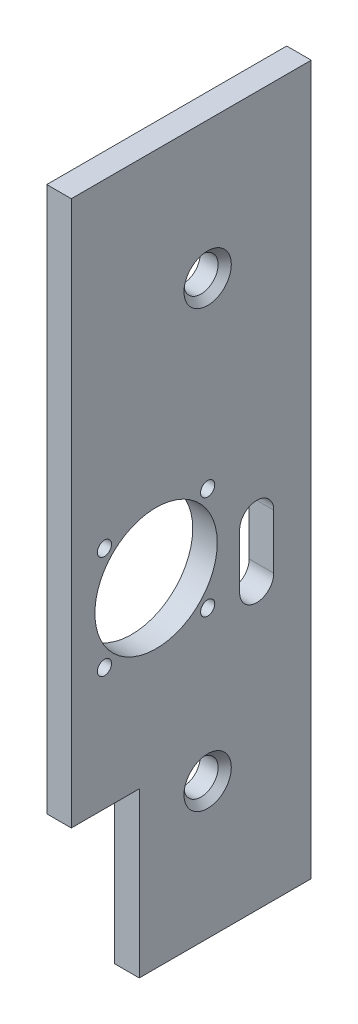
ISO-10303-21;
HEADER;
FILE_DESCRIPTION(('STEP AP214'),'2;1');
FILE_NAME('part.step','',(''),(''),'','','');
FILE_SCHEMA(('AUTOMOTIVE_DESIGN { 1 0 10303 214 1 1 1 1 }'));
ENDSEC;
DATA;
#1=APPLICATION_CONTEXT('core data for automotive mechanical design processes');
#2=APPLICATION_PROTOCOL_DEFINITION('international standard','automotive_design',2000,#1);
#3=PRODUCT_CONTEXT('',#1,'mechanical');
#4=PRODUCT('Part','Part','',(#3));
#5=PRODUCT_RELATED_PRODUCT_CATEGORY('part','',(#4));
#6=PRODUCT_DEFINITION_FORMATION('','',#4);
#7=PRODUCT_DEFINITION_CONTEXT('part definition',#1,'design');
#8=PRODUCT_DEFINITION('design','',#6,#7);
#9=PRODUCT_DEFINITION_SHAPE('','',#8);
#10=(LENGTH_UNIT() NAMED_UNIT(*) SI_UNIT(.MILLI.,.METRE.));
#11=(NAMED_UNIT(*) PLANE_ANGLE_UNIT() SI_UNIT($,.RADIAN.));
#12=(NAMED_UNIT(*) SI_UNIT($,.STERADIAN.) SOLID_ANGLE_UNIT());
#13=UNCERTAINTY_MEASURE_WITH_UNIT(LENGTH_MEASURE(1.E-05),#10,'distance_accuracy_value','');
#14=(GEOMETRIC_REPRESENTATION_CONTEXT(3) GLOBAL_UNCERTAINTY_ASSIGNED_CONTEXT((#13)) GLOBAL_UNIT_ASSIGNED_CONTEXT((#10,
#11,#12)) REPRESENTATION_CONTEXT('',''));
#15=CARTESIAN_POINT('',(0.,0.,0.));
#16=DIRECTION('',(0.,0.,1.));
#17=DIRECTION('',(1.,0.,0.));
#18=AXIS2_PLACEMENT_3D('',#15,#16,#17);
#19=CARTESIAN_POINT('',(5.715,0.,55.88));
#20=DIRECTION('',(0.,0.,-1.));
#21=DIRECTION('',(0.,1.,0.));
#22=AXIS2_PLACEMENT_3D('',#19,#20,#21);
#23=PLANE('',#22);
#24=DIRECTION('',(0.,-1.,0.));
#25=VECTOR('',#24,1.);
#26=CARTESIAN_POINT('',(0.,0.,55.88));
#27=LINE('',#26,#25);
#28=CARTESIAN_POINT('',(0.,0.,55.88));
#29=VERTEX_POINT('',#28);
#30=CARTESIAN_POINT('',(0.,-126.937814396124,55.88));
#31=VERTEX_POINT('',#30);
#32=EDGE_CURVE('E197',#29,#31,#27,.T.);
#33=ORIENTED_EDGE('',*,*,#32,.T.);
#34=DIRECTION('',(-1.,0.,0.));
#35=VECTOR('',#34,1.);
#36=CARTESIAN_POINT('',(5.715,-126.937814396124,55.88));
#37=LINE('',#36,#35);
#38=CARTESIAN_POINT('',(5.715,-126.937814396124,55.88));
#39=VERTEX_POINT('',#38);
#40=EDGE_CURVE('E227',#39,#31,#37,.T.);
#41=ORIENTED_EDGE('',*,*,#40,.F.);
#42=DIRECTION('',(0.,-1.,0.));
#43=VECTOR('',#42,1.);
#44=CARTESIAN_POINT('',(5.715,0.,55.88));
#45=LINE('',#44,#43);
#46=CARTESIAN_POINT('',(5.715,0.,55.88));
#47=VERTEX_POINT('',#46);
#48=EDGE_CURVE('E280',#47,#39,#45,.T.);
#49=ORIENTED_EDGE('',*,*,#48,.F.);
#50=DIRECTION('',(-1.,0.,0.));
#51=VECTOR('',#50,1.);
#52=CARTESIAN_POINT('',(5.715,0.,55.88));
#53=LINE('',#52,#51);
#54=EDGE_CURVE('E217',#47,#29,#53,.T.);
#55=ORIENTED_EDGE('',*,*,#54,.T.);
#56=EDGE_LOOP('',(#33,#41,#49,#55));
#57=FACE_BOUND('',#56,.T.);
#58=ADVANCED_FACE('F53',(#57),#23,.F.);
#59=CARTESIAN_POINT('',(5.715,-126.937814396124,0.));
#60=DIRECTION('',(0.,1.,0.));
#61=DIRECTION('',(0.,0.,1.));
#62=AXIS2_PLACEMENT_3D('',#59,#60,#61);
#63=PLANE('',#62);
#64=DIRECTION('',(0.,0.,-1.));
#65=VECTOR('',#64,1.);
#66=CARTESIAN_POINT('',(0.,-126.937814396124,0.));
#67=LINE('',#66,#65);
#68=CARTESIAN_POINT('',(0.,-126.937814396124,40.0525783544723));
#69=VERTEX_POINT('',#68);
#70=EDGE_CURVE('E201',#31,#69,#67,.T.);
#71=ORIENTED_EDGE('',*,*,#70,.T.);
#72=DIRECTION('',(-1.,0.,0.));
#73=VECTOR('',#72,1.);
#74=CARTESIAN_POINT('',(5.715,-126.937814396124,40.0525783544723));
#75=LINE('',#74,#73);
#76=CARTESIAN_POINT('',(5.715,-126.937814396124,40.0525783544723));
#77=VERTEX_POINT('',#76);
#78=EDGE_CURVE('E224',#77,#69,#75,.T.);
#79=ORIENTED_EDGE('',*,*,#78,.F.);
#80=DIRECTION('',(0.,0.,-1.));
#81=VECTOR('',#80,1.);
#82=CARTESIAN_POINT('',(5.715,-126.937814396124,0.));
#83=LINE('',#82,#81);
#84=EDGE_CURVE('E354',#39,#77,#83,.T.);
#85=ORIENTED_EDGE('',*,*,#84,.F.);
#86=ORIENTED_EDGE('',*,*,#40,.T.);
#87=EDGE_LOOP('',(#71,#79,#85,#86));
#88=FACE_BOUND('',#87,.T.);
#89=ADVANCED_FACE('F294',(#88),#63,.F.);
#90=CARTESIAN_POINT('',(5.715,0.,40.0525783544723));
#91=DIRECTION('',(0.,0.,1.));
#92=DIRECTION('',(1.,0.,0.));
#93=AXIS2_PLACEMENT_3D('',#90,#91,#92);
#94=PLANE('',#93);
#95=DIRECTION('',(0.,1.,0.));
#96=VECTOR('',#95,1.);
#97=CARTESIAN_POINT('',(0.,0.,40.0525783544723));
#98=LINE('',#97,#96);
#99=CARTESIAN_POINT('',(0.,-165.1,40.0525783544723));
#100=VERTEX_POINT('',#99);
#101=EDGE_CURVE('E205',#100,#69,#98,.T.);
#102=ORIENTED_EDGE('',*,*,#101,.F.);
#103=DIRECTION('',(-1.,0.,0.));
#104=VECTOR('',#103,1.);
#105=CARTESIAN_POINT('',(5.715,-165.1,40.0525783544723));
#106=LINE('',#105,#104);
#107=CARTESIAN_POINT('',(5.715,-165.1,40.0525783544723));
#108=VERTEX_POINT('',#107);
#109=EDGE_CURVE('E151',#108,#100,#106,.T.);
#110=ORIENTED_EDGE('',*,*,#109,.F.);
#111=DIRECTION('',(0.,1.,0.));
#112=VECTOR('',#111,1.);
#113=CARTESIAN_POINT('',(5.715,0.,40.0525783544723));
#114=LINE('',#113,#112);
#115=EDGE_CURVE('E157',#108,#77,#114,.T.);
#116=ORIENTED_EDGE('',*,*,#115,.T.);
#117=ORIENTED_EDGE('',*,*,#78,.T.);
#118=EDGE_LOOP('',(#102,#110,#116,#117));
#119=FACE_BOUND('',#118,.T.);
#120=ADVANCED_FACE('F299',(#119),#94,.T.);
#121=CARTESIAN_POINT('',(5.715,-165.1,0.));
#122=DIRECTION('',(0.,-1.,0.));
#123=DIRECTION('',(0.,0.,-1.));
#124=AXIS2_PLACEMENT_3D('',#121,#122,#123);
#125=PLANE('',#124);
#126=DIRECTION('',(0.,0.,1.));
#127=VECTOR('',#126,1.);
#128=CARTESIAN_POINT('',(0.,-165.1,0.));
#129=LINE('',#128,#127);
#130=CARTESIAN_POINT('',(0.,-165.1,0.));
#131=VERTEX_POINT('',#130);
#132=EDGE_CURVE('E145',#131,#100,#129,.T.);
#133=ORIENTED_EDGE('',*,*,#132,.F.);
#134=DIRECTION('',(-1.,0.,0.));
#135=VECTOR('',#134,1.);
#136=CARTESIAN_POINT('',(5.715,-165.1,0.));
#137=LINE('',#136,#135);
#138=CARTESIAN_POINT('',(5.715,-165.1,0.));
#139=VERTEX_POINT('',#138);
#140=EDGE_CURVE('E140',#139,#131,#137,.T.);
#141=ORIENTED_EDGE('',*,*,#140,.F.);
#142=DIRECTION('',(0.,0.,1.));
#143=VECTOR('',#142,1.);
#144=CARTESIAN_POINT('',(5.715,-165.1,0.));
#145=LINE('',#144,#143);
#146=EDGE_CURVE('E143',#139,#108,#145,.T.);
#147=ORIENTED_EDGE('',*,*,#146,.T.);
#148=ORIENTED_EDGE('',*,*,#109,.T.);
#149=EDGE_LOOP('',(#133,#141,#147,#148));
#150=FACE_BOUND('',#149,.T.);
#151=ADVANCED_FACE('F142',(#150),#125,.T.);
#152=CARTESIAN_POINT('',(5.715,0.,0.));
#153=DIRECTION('',(0.,0.,-1.));
#154=DIRECTION('',(0.,1.,0.));
#155=AXIS2_PLACEMENT_3D('',#152,#153,#154);
#156=PLANE('',#155);
#157=DIRECTION('',(0.,-1.,0.));
#158=VECTOR('',#157,1.);
#159=CARTESIAN_POINT('',(0.,0.,0.));
#160=LINE('',#159,#158);
#161=CARTESIAN_POINT('',(0.,0.,0.));
#162=VERTEX_POINT('',#161);
#163=EDGE_CURVE('E211',#162,#131,#160,.T.);
#164=ORIENTED_EDGE('',*,*,#163,.F.);
#165=DIRECTION('',(-1.,0.,0.));
#166=VECTOR('',#165,1.);
#167=CARTESIAN_POINT('',(5.715,0.,0.));
#168=LINE('',#167,#166);
#169=CARTESIAN_POINT('',(5.715,0.,0.));
#170=VERTEX_POINT('',#169);
#171=EDGE_CURVE('E106',#170,#162,#168,.T.);
#172=ORIENTED_EDGE('',*,*,#171,.F.);
#173=DIRECTION('',(0.,-1.,0.));
#174=VECTOR('',#173,1.);
#175=CARTESIAN_POINT('',(5.715,0.,0.));
#176=LINE('',#175,#174);
#177=EDGE_CURVE('E155',#170,#139,#176,.T.);
#178=ORIENTED_EDGE('',*,*,#177,.T.);
#179=ORIENTED_EDGE('',*,*,#140,.T.);
#180=EDGE_LOOP('',(#164,#172,#178,#179));
#181=FACE_BOUND('',#180,.T.);
#182=ADVANCED_FACE('F160',(#181),#156,.T.);
#183=CARTESIAN_POINT('',(5.715,-86.3988461493055,12.7));
#184=DIRECTION('',(-1.,0.,0.));
#185=DIRECTION('',(0.,0.,1.));
#186=AXIS2_PLACEMENT_3D('',#183,#184,#185);
#187=CYLINDRICAL_SURFACE('',#186,3.96875);
#188=CARTESIAN_POINT('',(0.,-86.3988461493055,12.7));
#189=DIRECTION('',(1.,0.,0.));
#190=DIRECTION('',(0.,0.,-1.));
#191=AXIS2_PLACEMENT_3D('',#188,#189,#190);
#192=CIRCLE('',#191,3.96875);
#193=CARTESIAN_POINT('',(0.,-86.3988461493055,8.73124999999999));
#194=VERTEX_POINT('',#193);
#195=CARTESIAN_POINT('',(0.,-86.3988461493055,16.66875));
#196=VERTEX_POINT('',#195);
#197=EDGE_CURVE('E172',#194,#196,#192,.T.);
#198=ORIENTED_EDGE('',*,*,#197,.F.);
#199=DIRECTION('',(-1.,0.,0.));
#200=VECTOR('',#199,1.);
#201=CARTESIAN_POINT('',(5.715,-86.3988461493055,8.73124999999999));
#202=LINE('',#201,#200);
#203=CARTESIAN_POINT('',(5.715,-86.3988461493055,8.73124999999999));
#204=VERTEX_POINT('',#203);
#205=EDGE_CURVE('E117',#204,#194,#202,.T.);
#206=ORIENTED_EDGE('',*,*,#205,.F.);
#207=CARTESIAN_POINT('',(5.715,-86.3988461493055,12.7));
#208=DIRECTION('',(1.,0.,0.));
#209=DIRECTION('',(0.,0.,-1.));
#210=AXIS2_PLACEMENT_3D('',#207,#208,#209);
#211=CIRCLE('',#210,3.96875);
#212=CARTESIAN_POINT('',(5.715,-86.3988461493055,16.66875));
#213=VERTEX_POINT('',#212);
#214=EDGE_CURVE('E341',#204,#213,#211,.T.);
#215=ORIENTED_EDGE('',*,*,#214,.T.);
#216=DIRECTION('',(-1.,0.,0.));
#217=VECTOR('',#216,1.);
#218=CARTESIAN_POINT('',(5.715,-86.3988461493055,16.66875));
#219=LINE('',#218,#217);
#220=EDGE_CURVE('E164',#213,#196,#219,.T.);
#221=ORIENTED_EDGE('',*,*,#220,.T.);
#222=EDGE_LOOP('',(#198,#206,#215,#221));
#223=FACE_BOUND('',#222,.T.);
#224=ADVANCED_FACE('F317',(#223),#187,.F.);
#225=CARTESIAN_POINT('',(5.715,0.,8.73124999999999));
#226=DIRECTION('',(0.,0.,1.));
#227=DIRECTION('',(1.,0.,0.));
#228=AXIS2_PLACEMENT_3D('',#225,#226,#227);
#229=PLANE('',#228);
#230=DIRECTION('',(0.,1.,0.));
#231=VECTOR('',#230,1.);
#232=CARTESIAN_POINT('',(0.,0.,8.73124999999999));
#233=LINE('',#232,#231);
#234=CARTESIAN_POINT('',(0.,-99.0988461493055,8.73124999999999));
#235=VERTEX_POINT('',#234);
#236=EDGE_CURVE('E177',#235,#194,#233,.T.);
#237=ORIENTED_EDGE('',*,*,#236,.F.);
#238=DIRECTION('',(-1.,0.,0.));
#239=VECTOR('',#238,1.);
#240=CARTESIAN_POINT('',(5.715,-99.0988461493055,8.73124999999999));
#241=LINE('',#240,#239);
#242=CARTESIAN_POINT('',(5.715,-99.0988461493055,8.73124999999999));
#243=VERTEX_POINT('',#242);
#244=EDGE_CURVE('E237',#243,#235,#241,.T.);
#245=ORIENTED_EDGE('',*,*,#244,.F.);
#246=DIRECTION('',(0.,1.,0.));
#247=VECTOR('',#246,1.);
#248=CARTESIAN_POINT('',(5.715,0.,8.73124999999999));
#249=LINE('',#248,#247);
#250=EDGE_CURVE('E335',#243,#204,#249,.T.);
#251=ORIENTED_EDGE('',*,*,#250,.T.);
#252=ORIENTED_EDGE('',*,*,#205,.T.);
#253=EDGE_LOOP('',(#237,#245,#251,#252));
#254=FACE_BOUND('',#253,.T.);
#255=ADVANCED_FACE('F313',(#254),#229,.T.);
#256=CARTESIAN_POINT('',(5.715,-99.0988461493055,12.7));
#257=DIRECTION('',(-1.,0.,0.));
#258=DIRECTION('',(0.,0.,1.));
#259=AXIS2_PLACEMENT_3D('',#256,#257,#258);
#260=CYLINDRICAL_SURFACE('',#259,3.96875);
#261=CARTESIAN_POINT('',(0.,-99.0988461493055,12.7));
#262=DIRECTION('',(1.,0.,0.));
#263=DIRECTION('',(0.,0.,-1.));
#264=AXIS2_PLACEMENT_3D('',#261,#262,#263);
#265=CIRCLE('',#264,3.96875);
#266=CARTESIAN_POINT('',(0.,-99.0988461493055,16.66875));
#267=VERTEX_POINT('',#266);
#268=EDGE_CURVE('E181',#267,#235,#265,.T.);
#269=ORIENTED_EDGE('',*,*,#268,.F.);
#270=DIRECTION('',(-1.,0.,0.));
#271=VECTOR('',#270,1.);
#272=CARTESIAN_POINT('',(5.715,-99.0988461493055,16.66875));
#273=LINE('',#272,#271);
#274=CARTESIAN_POINT('',(5.715,-99.0988461493055,16.66875));
#275=VERTEX_POINT('',#274);
#276=EDGE_CURVE('E234',#275,#267,#273,.T.);
#277=ORIENTED_EDGE('',*,*,#276,.F.);
#278=CARTESIAN_POINT('',(5.715,-99.0988461493055,12.7));
#279=DIRECTION('',(1.,0.,0.));
#280=DIRECTION('',(0.,0.,-1.));
#281=AXIS2_PLACEMENT_3D('',#278,#279,#280);
#282=CIRCLE('',#281,3.96875);
#283=EDGE_CURVE('E340',#275,#243,#282,.T.);
#284=ORIENTED_EDGE('',*,*,#283,.T.);
#285=ORIENTED_EDGE('',*,*,#244,.T.);
#286=EDGE_LOOP('',(#269,#277,#284,#285));
#287=FACE_BOUND('',#286,.T.);
#288=ADVANCED_FACE('F305',(#287),#260,.F.);
#289=CARTESIAN_POINT('',(5.715,-133.35,24.13));
#290=DIRECTION('',(-1.,0.,0.));
#291=DIRECTION('',(0.,0.,1.));
#292=AXIS2_PLACEMENT_3D('',#289,#290,#291);
#293=CYLINDRICAL_SURFACE('',#292,3.97510000000001);
#294=CARTESIAN_POINT('',(4.17829999999994,-133.35,24.13));
#295=DIRECTION('',(1.,0.,0.));
#296=DIRECTION('',(0.,0.,-1.));
#297=AXIS2_PLACEMENT_3D('',#294,#295,#296);
#298=CIRCLE('',#297,3.97510000000001);
#299=CARTESIAN_POINT('',(4.17829999999994,-133.35,20.1549));
#300=VERTEX_POINT('',#299);
#301=EDGE_CURVE('E11',#300,#300,#298,.T.);
#302=ORIENTED_EDGE('',*,*,#301,.T.);
#303=EDGE_LOOP('',(#302));
#304=FACE_BOUND('',#303,.T.);
#305=CARTESIAN_POINT('',(0.,-133.35,24.13));
#306=DIRECTION('',(1.,0.,0.));
#307=DIRECTION('',(0.,0.,-1.));
#308=AXIS2_PLACEMENT_3D('',#305,#306,#307);
#309=CIRCLE('',#308,3.97510000000001);
#310=CARTESIAN_POINT('',(0.,-133.35,20.1549));
#311=VERTEX_POINT('',#310);
#312=EDGE_CURVE('E193',#311,#311,#309,.T.);
#313=ORIENTED_EDGE('',*,*,#312,.F.);
#314=EDGE_LOOP('',(#313));
#315=FACE_BOUND('',#314,.T.);
#316=ADVANCED_FACE('F264',(#304,#315),#293,.F.);
#317=CARTESIAN_POINT('',(5.715,-31.9024,24.13));
#318=DIRECTION('',(-1.,0.,0.));
#319=DIRECTION('',(0.,0.,1.));
#320=AXIS2_PLACEMENT_3D('',#317,#318,#319);
#321=CYLINDRICAL_SURFACE('',#320,3.9751);
#322=CARTESIAN_POINT('',(4.17829999999999,-31.9024,24.13));
#323=DIRECTION('',(1.,0.,0.));
#324=DIRECTION('',(0.,0.,-1.));
#325=AXIS2_PLACEMENT_3D('',#322,#323,#324);
#326=CIRCLE('',#325,3.9751);
#327=CARTESIAN_POINT('',(4.17829999999999,-31.9024,20.1549));
#328=VERTEX_POINT('',#327);
#329=EDGE_CURVE('E231',#328,#328,#326,.T.);
#330=ORIENTED_EDGE('',*,*,#329,.T.);
#331=EDGE_LOOP('',(#330));
#332=FACE_BOUND('',#331,.T.);
#333=CARTESIAN_POINT('',(0.,-31.9024,24.13));
#334=DIRECTION('',(1.,0.,0.));
#335=DIRECTION('',(0.,0.,-1.));
#336=AXIS2_PLACEMENT_3D('',#333,#334,#335);
#337=CIRCLE('',#336,3.9751);
#338=CARTESIAN_POINT('',(0.,-31.9024,20.1549));
#339=VERTEX_POINT('',#338);
#340=EDGE_CURVE('E189',#339,#339,#337,.T.);
#341=ORIENTED_EDGE('',*,*,#340,.F.);
#342=EDGE_LOOP('',(#341));
#343=FACE_BOUND('',#342,.T.);
#344=ADVANCED_FACE('F260',(#332,#343),#321,.F.);
#345=CARTESIAN_POINT('',(5.715,0.,16.66875));
#346=DIRECTION('',(0.,0.,1.));
#347=DIRECTION('',(1.,0.,0.));
#348=AXIS2_PLACEMENT_3D('',#345,#346,#347);
#349=PLANE('',#348);
#350=DIRECTION('',(0.,1.,0.));
#351=VECTOR('',#350,1.);
#352=CARTESIAN_POINT('',(0.,0.,16.66875));
#353=LINE('',#352,#351);
#354=EDGE_CURVE('E185',#267,#196,#353,.T.);
#355=ORIENTED_EDGE('',*,*,#354,.T.);
#356=ORIENTED_EDGE('',*,*,#220,.F.);
#357=DIRECTION('',(0.,1.,0.));
#358=VECTOR('',#357,1.);
#359=CARTESIAN_POINT('',(5.715,0.,16.66875));
#360=LINE('',#359,#358);
#361=EDGE_CURVE('E345',#275,#213,#360,.T.);
#362=ORIENTED_EDGE('',*,*,#361,.F.);
#363=ORIENTED_EDGE('',*,*,#276,.T.);
#364=EDGE_LOOP('',(#355,#356,#362,#363));
#365=FACE_BOUND('',#364,.T.);
#366=ADVANCED_FACE('F263',(#365),#349,.F.);
#367=CARTESIAN_POINT('',(5.715,-86.3988461493055,36.1376605492201));
#368=DIRECTION('',(-1.,0.,0.));
#369=DIRECTION('',(0.,0.,1.));
#370=AXIS2_PLACEMENT_3D('',#367,#368,#369);
#371=CYLINDRICAL_SURFACE('',#370,14.249999948);
#372=CARTESIAN_POINT('',(5.715,-86.3988461493055,36.1376605492201));
#373=DIRECTION('',(1.,0.,0.));
#374=DIRECTION('',(0.,0.,-1.));
#375=AXIS2_PLACEMENT_3D('',#372,#373,#374);
#376=CIRCLE('',#375,14.249999948);
#377=CARTESIAN_POINT('',(5.715,-86.3988461493055,21.8876606012201));
#378=VERTEX_POINT('',#377);
#379=EDGE_CURVE('E216',#378,#378,#376,.T.);
#380=ORIENTED_EDGE('',*,*,#379,.T.);
#381=EDGE_LOOP('',(#380));
#382=FACE_BOUND('',#381,.T.);
#383=CARTESIAN_POINT('',(0.,-86.3988461493055,36.1376605492201));
#384=DIRECTION('',(1.,0.,0.));
#385=DIRECTION('',(0.,0.,-1.));
#386=AXIS2_PLACEMENT_3D('',#383,#384,#385);
#387=CIRCLE('',#386,14.249999948);
#388=CARTESIAN_POINT('',(0.,-86.3988461493055,21.8876606012201));
#389=VERTEX_POINT('',#388);
#390=EDGE_CURVE('E168',#389,#389,#387,.T.);
#391=ORIENTED_EDGE('',*,*,#390,.F.);
#392=EDGE_LOOP('',(#391));
#393=FACE_BOUND('',#392,.T.);
#394=ADVANCED_FACE('F283',(#382,#393),#371,.F.);
#395=CARTESIAN_POINT('',(5.715,0.,0.));
#396=DIRECTION('',(0.,-1.,0.));
#397=DIRECTION('',(0.,0.,-1.));
#398=AXIS2_PLACEMENT_3D('',#395,#396,#397);
#399=PLANE('',#398);
#400=DIRECTION('',(0.,0.,1.));
#401=VECTOR('',#400,1.);
#402=CARTESIAN_POINT('',(0.,0.,0.));
#403=LINE('',#402,#401);
#404=EDGE_CURVE('E109',#162,#29,#403,.T.);
#405=ORIENTED_EDGE('',*,*,#404,.T.);
#406=ORIENTED_EDGE('',*,*,#54,.F.);
#407=DIRECTION('',(0.,0.,1.));
#408=VECTOR('',#407,1.);
#409=CARTESIAN_POINT('',(5.715,0.,0.));
#410=LINE('',#409,#408);
#411=EDGE_CURVE('E72',#170,#47,#410,.T.);
#412=ORIENTED_EDGE('',*,*,#411,.F.);
#413=ORIENTED_EDGE('',*,*,#171,.T.);
#414=EDGE_LOOP('',(#405,#406,#412,#413));
#415=FACE_BOUND('',#414,.T.);
#416=ADVANCED_FACE('F281',(#415),#399,.F.);
#417=CARTESIAN_POINT('',(5.715,0.,0.));
#418=DIRECTION('',(1.,0.,0.));
#419=DIRECTION('',(0.,0.,-1.));
#420=AXIS2_PLACEMENT_3D('',#417,#418,#419);
#421=PLANE('',#420);
#422=CARTESIAN_POINT('',(5.715,-31.9024,24.13));
#423=DIRECTION('',(1.,0.,0.));
#424=DIRECTION('',(0.,0.,-1.));
#425=AXIS2_PLACEMENT_3D('',#422,#423,#424);
#426=CIRCLE('',#425,5.51180000000001);
#427=CARTESIAN_POINT('',(5.715,-31.9024,18.6182));
#428=VERTEX_POINT('',#427);
#429=EDGE_CURVE('E64',#428,#428,#426,.F.);
#430=ORIENTED_EDGE('',*,*,#429,.T.);
#431=EDGE_LOOP('',(#430));
#432=FACE_BOUND('',#431,.T.);
#433=CARTESIAN_POINT('',(5.715,-133.35,24.13));
#434=DIRECTION('',(1.,0.,0.));
#435=DIRECTION('',(0.,0.,-1.));
#436=AXIS2_PLACEMENT_3D('',#433,#434,#435);
#437=CIRCLE('',#436,5.51180000000007);
#438=CARTESIAN_POINT('',(5.715,-133.35,18.6181999999999));
#439=VERTEX_POINT('',#438);
#440=EDGE_CURVE('E245',#439,#439,#437,.F.);
#441=ORIENTED_EDGE('',*,*,#440,.T.);
#442=EDGE_LOOP('',(#441));
#443=FACE_BOUND('',#442,.T.);
#444=CARTESIAN_POINT('',(5.715,-74.3780308436784,48.1584758548473));
#445=DIRECTION('',(1.,0.,0.));
#446=DIRECTION('',(0.,0.,-1.));
#447=AXIS2_PLACEMENT_3D('',#444,#445,#446);
#448=CIRCLE('',#447,1.64999999999998);
#449=CARTESIAN_POINT('',(5.715,-74.3780308436784,46.5084758548473));
#450=VERTEX_POINT('',#449);
#451=EDGE_CURVE('E504',#450,#450,#448,.T.);
#452=ORIENTED_EDGE('',*,*,#451,.F.);
#453=EDGE_LOOP('',(#452));
#454=FACE_BOUND('',#453,.T.);
#455=CARTESIAN_POINT('',(5.715,-74.3780308436784,24.1168452435929));
#456=DIRECTION('',(1.,0.,0.));
#457=DIRECTION('',(0.,0.,-1.));
#458=AXIS2_PLACEMENT_3D('',#455,#456,#457);
#459=CIRCLE('',#458,1.64999999999998);
#460=CARTESIAN_POINT('',(5.715,-74.3780308436784,22.466845243593));
#461=VERTEX_POINT('',#460);
#462=EDGE_CURVE('E508',#461,#461,#459,.T.);
#463=ORIENTED_EDGE('',*,*,#462,.F.);
#464=EDGE_LOOP('',(#463));
#465=FACE_BOUND('',#464,.T.);
#466=CARTESIAN_POINT('',(5.715,-98.4196614549327,24.1168452435929));
#467=DIRECTION('',(1.,0.,0.));
#468=DIRECTION('',(0.,0.,-1.));
#469=AXIS2_PLACEMENT_3D('',#466,#467,#468);
#470=CIRCLE('',#469,1.64999999999998);
#471=CARTESIAN_POINT('',(5.715,-98.4196614549327,22.466845243593));
#472=VERTEX_POINT('',#471);
#473=EDGE_CURVE('E512',#472,#472,#470,.T.);
#474=ORIENTED_EDGE('',*,*,#473,.F.);
#475=EDGE_LOOP('',(#474));
#476=FACE_BOUND('',#475,.T.);
#477=CARTESIAN_POINT('',(5.715,-98.4196614549327,48.1584758548472));
#478=DIRECTION('',(1.,0.,0.));
#479=DIRECTION('',(0.,0.,-1.));
#480=AXIS2_PLACEMENT_3D('',#477,#478,#479);
#481=CIRCLE('',#480,1.64999999999998);
#482=CARTESIAN_POINT('',(5.715,-98.4196614549327,46.5084758548473));
#483=VERTEX_POINT('',#482);
#484=EDGE_CURVE('E516',#483,#483,#481,.T.);
#485=ORIENTED_EDGE('',*,*,#484,.F.);
#486=EDGE_LOOP('',(#485));
#487=FACE_BOUND('',#486,.T.);
#488=ORIENTED_EDGE('',*,*,#379,.F.);
#489=EDGE_LOOP('',(#488));
#490=FACE_BOUND('',#489,.T.);
#491=ORIENTED_EDGE('',*,*,#214,.F.);
#492=ORIENTED_EDGE('',*,*,#250,.F.);
#493=ORIENTED_EDGE('',*,*,#283,.F.);
#494=ORIENTED_EDGE('',*,*,#361,.T.);
#495=EDGE_LOOP('',(#491,#492,#493,#494));
#496=FACE_BOUND('',#495,.T.);
#497=ORIENTED_EDGE('',*,*,#48,.T.);
#498=ORIENTED_EDGE('',*,*,#84,.T.);
#499=ORIENTED_EDGE('',*,*,#115,.F.);
#500=ORIENTED_EDGE('',*,*,#146,.F.);
#501=ORIENTED_EDGE('',*,*,#177,.F.);
#502=ORIENTED_EDGE('',*,*,#411,.T.);
#503=EDGE_LOOP('',(#497,#498,#499,#500,#501,#502));
#504=FACE_BOUND('',#503,.T.);
#505=ADVANCED_FACE('F154',(#432,#443,#454,#465,#476,#487,#490,#496,#504),#421,.T.);
#506=CARTESIAN_POINT('',(0.,0.,0.));
#507=DIRECTION('',(1.,0.,0.));
#508=DIRECTION('',(0.,0.,-1.));
#509=AXIS2_PLACEMENT_3D('',#506,#507,#508);
#510=PLANE('',#509);
#511=CARTESIAN_POINT('',(0.,-74.3780308436784,48.1584758548473));
#512=DIRECTION('',(1.,0.,0.));
#513=DIRECTION('',(0.,0.,-1.));
#514=AXIS2_PLACEMENT_3D('',#511,#512,#513);
#515=CIRCLE('',#514,1.64999999999999);
#516=CARTESIAN_POINT('',(0.,-74.3780308436784,46.5084758548473));
#517=VERTEX_POINT('',#516);
#518=EDGE_CURVE('E539',#517,#517,#515,.T.);
#519=ORIENTED_EDGE('',*,*,#518,.T.);
#520=EDGE_LOOP('',(#519));
#521=FACE_BOUND('',#520,.T.);
#522=CARTESIAN_POINT('',(0.,-74.3780308436784,24.1168452435929));
#523=DIRECTION('',(1.,0.,0.));
#524=DIRECTION('',(0.,0.,-1.));
#525=AXIS2_PLACEMENT_3D('',#522,#523,#524);
#526=CIRCLE('',#525,1.64999999999999);
#527=CARTESIAN_POINT('',(0.,-74.3780308436784,22.466845243593));
#528=VERTEX_POINT('',#527);
#529=EDGE_CURVE('E533',#528,#528,#526,.T.);
#530=ORIENTED_EDGE('',*,*,#529,.T.);
#531=EDGE_LOOP('',(#530));
#532=FACE_BOUND('',#531,.T.);
#533=CARTESIAN_POINT('',(0.,-98.4196614549327,24.1168452435929));
#534=DIRECTION('',(1.,0.,0.));
#535=DIRECTION('',(0.,0.,-1.));
#536=AXIS2_PLACEMENT_3D('',#533,#534,#535);
#537=CIRCLE('',#536,1.64999999999999);
#538=CARTESIAN_POINT('',(0.,-98.4196614549327,22.466845243593));
#539=VERTEX_POINT('',#538);
#540=EDGE_CURVE('E527',#539,#539,#537,.T.);
#541=ORIENTED_EDGE('',*,*,#540,.T.);
#542=EDGE_LOOP('',(#541));
#543=FACE_BOUND('',#542,.T.);
#544=CARTESIAN_POINT('',(0.,-98.4196614549327,48.1584758548472));
#545=DIRECTION('',(1.,0.,0.));
#546=DIRECTION('',(0.,0.,-1.));
#547=AXIS2_PLACEMENT_3D('',#544,#545,#546);
#548=CIRCLE('',#547,1.64999999999999);
#549=CARTESIAN_POINT('',(0.,-98.4196614549327,46.5084758548473));
#550=VERTEX_POINT('',#549);
#551=EDGE_CURVE('E173',#550,#550,#548,.T.);
#552=ORIENTED_EDGE('',*,*,#551,.T.);
#553=EDGE_LOOP('',(#552));
#554=FACE_BOUND('',#553,.T.);
#555=ORIENTED_EDGE('',*,*,#390,.T.);
#556=EDGE_LOOP('',(#555));
#557=FACE_BOUND('',#556,.T.);
#558=ORIENTED_EDGE('',*,*,#197,.T.);
#559=ORIENTED_EDGE('',*,*,#354,.F.);
#560=ORIENTED_EDGE('',*,*,#268,.T.);
#561=ORIENTED_EDGE('',*,*,#236,.T.);
#562=EDGE_LOOP('',(#558,#559,#560,#561));
#563=FACE_BOUND('',#562,.T.);
#564=ORIENTED_EDGE('',*,*,#340,.T.);
#565=EDGE_LOOP('',(#564));
#566=FACE_BOUND('',#565,.T.);
#567=ORIENTED_EDGE('',*,*,#312,.T.);
#568=EDGE_LOOP('',(#567));
#569=FACE_BOUND('',#568,.T.);
#570=ORIENTED_EDGE('',*,*,#32,.F.);
#571=ORIENTED_EDGE('',*,*,#404,.F.);
#572=ORIENTED_EDGE('',*,*,#163,.T.);
#573=ORIENTED_EDGE('',*,*,#132,.T.);
#574=ORIENTED_EDGE('',*,*,#101,.T.);
#575=ORIENTED_EDGE('',*,*,#70,.F.);
#576=EDGE_LOOP('',(#570,#571,#572,#573,#574,#575));
#577=FACE_BOUND('',#576,.T.);
#578=ADVANCED_FACE('F268',(#521,#532,#543,#554,#557,#563,#566,#569,#577),#510,.F.);
#579=CARTESIAN_POINT('',(5.715,-98.4196614549327,48.1584758548472));
#580=DIRECTION('',(1.,0.,0.));
#581=DIRECTION('',(0.,0.,-1.));
#582=AXIS2_PLACEMENT_3D('',#579,#580,#581);
#583=CYLINDRICAL_SURFACE('',#582,1.64999999999999);
#584=ORIENTED_EDGE('',*,*,#551,.F.);
#585=EDGE_LOOP('',(#584));
#586=FACE_BOUND('',#585,.T.);
#587=ORIENTED_EDGE('',*,*,#484,.T.);
#588=EDGE_LOOP('',(#587));
#589=FACE_BOUND('',#588,.T.);
#590=ADVANCED_FACE('F271',(#586,#589),#583,.F.);
#591=CARTESIAN_POINT('',(5.715,-98.4196614549327,24.1168452435929));
#592=DIRECTION('',(1.,0.,0.));
#593=DIRECTION('',(0.,0.,-1.));
#594=AXIS2_PLACEMENT_3D('',#591,#592,#593);
#595=CYLINDRICAL_SURFACE('',#594,1.64999999999999);
#596=ORIENTED_EDGE('',*,*,#540,.F.);
#597=EDGE_LOOP('',(#596));
#598=FACE_BOUND('',#597,.T.);
#599=ORIENTED_EDGE('',*,*,#473,.T.);
#600=EDGE_LOOP('',(#599));
#601=FACE_BOUND('',#600,.T.);
#602=ADVANCED_FACE('F444',(#598,#601),#595,.F.);
#603=CARTESIAN_POINT('',(5.715,-74.3780308436784,24.1168452435929));
#604=DIRECTION('',(1.,0.,0.));
#605=DIRECTION('',(0.,0.,-1.));
#606=AXIS2_PLACEMENT_3D('',#603,#604,#605);
#607=CYLINDRICAL_SURFACE('',#606,1.64999999999999);
#608=ORIENTED_EDGE('',*,*,#529,.F.);
#609=EDGE_LOOP('',(#608));
#610=FACE_BOUND('',#609,.T.);
#611=ORIENTED_EDGE('',*,*,#462,.T.);
#612=EDGE_LOOP('',(#611));
#613=FACE_BOUND('',#612,.T.);
#614=ADVANCED_FACE('F456',(#610,#613),#607,.F.);
#615=CARTESIAN_POINT('',(5.715,-74.3780308436784,48.1584758548473));
#616=DIRECTION('',(1.,0.,0.));
#617=DIRECTION('',(0.,0.,-1.));
#618=AXIS2_PLACEMENT_3D('',#615,#616,#617);
#619=CYLINDRICAL_SURFACE('',#618,1.64999999999999);
#620=ORIENTED_EDGE('',*,*,#518,.F.);
#621=EDGE_LOOP('',(#620));
#622=FACE_BOUND('',#621,.T.);
#623=ORIENTED_EDGE('',*,*,#451,.T.);
#624=EDGE_LOOP('',(#623));
#625=FACE_BOUND('',#624,.T.);
#626=ADVANCED_FACE('F257',(#622,#625),#619,.F.);
#627=CARTESIAN_POINT('',(4.17829999999999,-31.9024,24.13));
#628=DIRECTION('',(1.,0.,0.));
#629=DIRECTION('',(0.,0.,-1.));
#630=AXIS2_PLACEMENT_3D('',#627,#628,#629);
#631=CONICAL_SURFACE('',#630,3.9751,0.785398163397448);
#632=ORIENTED_EDGE('',*,*,#429,.F.);
#633=EDGE_LOOP('',(#632));
#634=FACE_BOUND('',#633,.T.);
#635=ORIENTED_EDGE('',*,*,#329,.F.);
#636=EDGE_LOOP('',(#635));
#637=FACE_BOUND('',#636,.T.);
#638=ADVANCED_FACE('F254',(#634,#637),#631,.F.);
#639=CARTESIAN_POINT('',(4.17829999999994,-133.35,24.13));
#640=DIRECTION('',(1.,0.,0.));
#641=DIRECTION('',(0.,0.,-1.));
#642=AXIS2_PLACEMENT_3D('',#639,#640,#641);
#643=CONICAL_SURFACE('',#642,3.97510000000001,0.785398163397448);
#644=ORIENTED_EDGE('',*,*,#440,.F.);
#645=EDGE_LOOP('',(#644));
#646=FACE_BOUND('',#645,.T.);
#647=ORIENTED_EDGE('',*,*,#301,.F.);
#648=EDGE_LOOP('',(#647));
#649=FACE_BOUND('',#648,.T.);
#650=ADVANCED_FACE('F56',(#646,#649),#643,.F.);
#651=CLOSED_SHELL('',(#58,#89,#120,#151,#182,#224,#255,#288,#316,#344,#366,#394,#416,#505,#578,
#590,#602,#614,#626,#638,#650));
#652=MANIFOLD_SOLID_BREP('B2',#651);
#653=ADVANCED_BREP_SHAPE_REPRESENTATION('',(#18,#652),#14);
#654=SHAPE_DEFINITION_REPRESENTATION(#9,#653);
ENDSEC;
END-ISO-10303-21;
